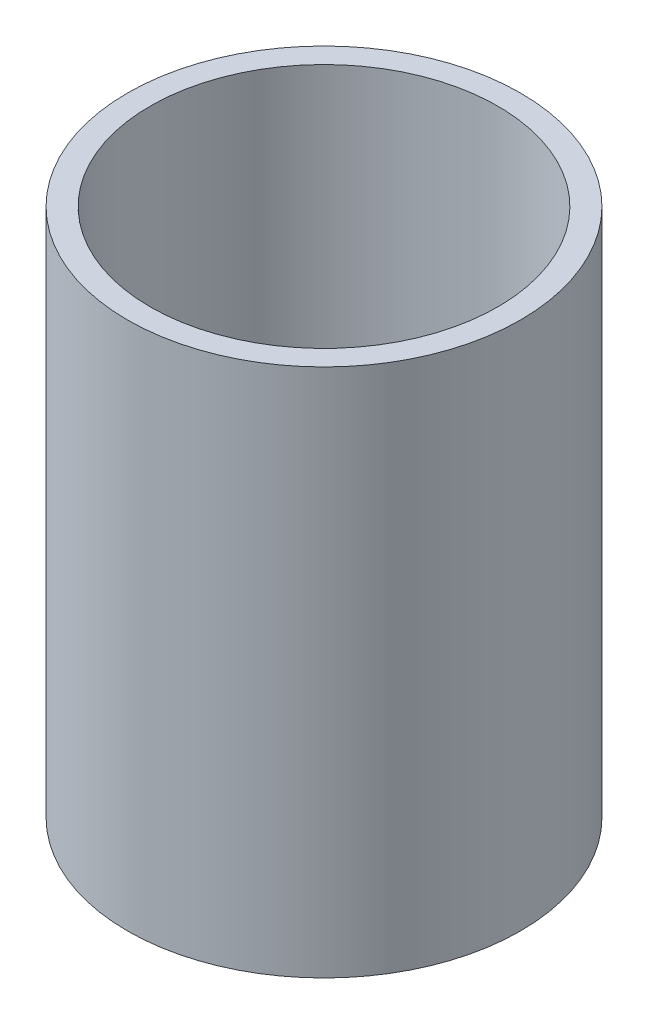
ISO-10303-21;
HEADER;
FILE_DESCRIPTION(('STEP AP214'),'2;1');
FILE_NAME('part.step','',(''),(''),'','','');
FILE_SCHEMA(('AUTOMOTIVE_DESIGN { 1 0 10303 214 1 1 1 1 }'));
ENDSEC;
DATA;
#1=APPLICATION_CONTEXT('core data for automotive mechanical design processes');
#2=APPLICATION_PROTOCOL_DEFINITION('international standard','automotive_design',2000,#1);
#3=PRODUCT_CONTEXT('',#1,'mechanical');
#4=PRODUCT('Part','Part','',(#3));
#5=PRODUCT_RELATED_PRODUCT_CATEGORY('part','',(#4));
#6=PRODUCT_DEFINITION_FORMATION('','',#4);
#7=PRODUCT_DEFINITION_CONTEXT('part definition',#1,'design');
#8=PRODUCT_DEFINITION('design','',#6,#7);
#9=PRODUCT_DEFINITION_SHAPE('','',#8);
#10=(LENGTH_UNIT() NAMED_UNIT(*) SI_UNIT(.MILLI.,.METRE.));
#11=(NAMED_UNIT(*) PLANE_ANGLE_UNIT() SI_UNIT($,.RADIAN.));
#12=(NAMED_UNIT(*) SI_UNIT($,.STERADIAN.) SOLID_ANGLE_UNIT());
#13=UNCERTAINTY_MEASURE_WITH_UNIT(LENGTH_MEASURE(1.E-05),#10,'distance_accuracy_value','');
#14=(GEOMETRIC_REPRESENTATION_CONTEXT(3) GLOBAL_UNCERTAINTY_ASSIGNED_CONTEXT((#13)) GLOBAL_UNIT_ASSIGNED_CONTEXT((#10,
#11,#12)) REPRESENTATION_CONTEXT('',''));
#15=CARTESIAN_POINT('',(0.,0.,0.));
#16=DIRECTION('',(0.,0.,1.));
#17=DIRECTION('',(1.,0.,0.));
#18=AXIS2_PLACEMENT_3D('',#15,#16,#17);
#19=CARTESIAN_POINT('',(0.,70.,0.));
#20=DIRECTION('',(0.,1.,0.));
#21=DIRECTION('',(0.,0.,1.));
#22=AXIS2_PLACEMENT_3D('',#19,#20,#21);
#23=PLANE('',#22);
#24=CARTESIAN_POINT('',(0.,70.,0.));
#25=DIRECTION('',(0.,1.,0.));
#26=DIRECTION('',(0.,0.,1.));
#27=AXIS2_PLACEMENT_3D('',#24,#25,#26);
#28=CIRCLE('',#27,26.);
#29=CARTESIAN_POINT('',(0.,70.,26.));
#30=VERTEX_POINT('',#29);
#31=EDGE_CURVE('E10',#30,#30,#28,.T.);
#32=ORIENTED_EDGE('',*,*,#31,.T.);
#33=EDGE_LOOP('',(#32));
#34=FACE_BOUND('',#33,.T.);
#35=CARTESIAN_POINT('',(0.,70.,0.));
#36=DIRECTION('',(0.,1.,0.));
#37=DIRECTION('',(0.,0.,1.));
#38=AXIS2_PLACEMENT_3D('',#35,#36,#37);
#39=CIRCLE('',#38,23.);
#40=CARTESIAN_POINT('',(0.,70.,23.));
#41=VERTEX_POINT('',#40);
#42=EDGE_CURVE('E46',#41,#41,#39,.T.);
#43=ORIENTED_EDGE('',*,*,#42,.F.);
#44=EDGE_LOOP('',(#43));
#45=FACE_BOUND('',#44,.T.);
#46=ADVANCED_FACE('F35',(#34,#45),#23,.T.);
#47=CARTESIAN_POINT('',(0.,0.,0.));
#48=DIRECTION('',(0.,1.,0.));
#49=DIRECTION('',(0.,0.,1.));
#50=AXIS2_PLACEMENT_3D('',#47,#48,#49);
#51=PLANE('',#50);
#52=CARTESIAN_POINT('',(0.,0.,0.));
#53=DIRECTION('',(0.,1.,0.));
#54=DIRECTION('',(0.,0.,1.));
#55=AXIS2_PLACEMENT_3D('',#52,#53,#54);
#56=CIRCLE('',#55,26.);
#57=CARTESIAN_POINT('',(0.,0.,26.));
#58=VERTEX_POINT('',#57);
#59=EDGE_CURVE('E39',#58,#58,#56,.T.);
#60=ORIENTED_EDGE('',*,*,#59,.F.);
#61=EDGE_LOOP('',(#60));
#62=FACE_BOUND('',#61,.T.);
#63=CARTESIAN_POINT('',(0.,0.,0.));
#64=DIRECTION('',(0.,1.,0.));
#65=DIRECTION('',(0.,0.,1.));
#66=AXIS2_PLACEMENT_3D('',#63,#64,#65);
#67=CIRCLE('',#66,23.);
#68=CARTESIAN_POINT('',(0.,0.,23.));
#69=VERTEX_POINT('',#68);
#70=EDGE_CURVE('E48',#69,#69,#67,.T.);
#71=ORIENTED_EDGE('',*,*,#70,.T.);
#72=EDGE_LOOP('',(#71));
#73=FACE_BOUND('',#72,.T.);
#74=ADVANCED_FACE('F58',(#62,#73),#51,.F.);
#75=CARTESIAN_POINT('',(0.,70.,0.));
#76=DIRECTION('',(0.,-1.,0.));
#77=DIRECTION('',(0.,0.,-1.));
#78=AXIS2_PLACEMENT_3D('',#75,#76,#77);
#79=CYLINDRICAL_SURFACE('',#78,26.);
#80=ORIENTED_EDGE('',*,*,#31,.F.);
#81=EDGE_LOOP('',(#80));
#82=FACE_BOUND('',#81,.T.);
#83=ORIENTED_EDGE('',*,*,#59,.T.);
#84=EDGE_LOOP('',(#83));
#85=FACE_BOUND('',#84,.T.);
#86=ADVANCED_FACE('F37',(#82,#85),#79,.T.);
#87=CARTESIAN_POINT('',(0.,70.,0.));
#88=DIRECTION('',(0.,-1.,0.));
#89=DIRECTION('',(0.,0.,-1.));
#90=AXIS2_PLACEMENT_3D('',#87,#88,#89);
#91=CYLINDRICAL_SURFACE('',#90,23.);
#92=ORIENTED_EDGE('',*,*,#42,.T.);
#93=EDGE_LOOP('',(#92));
#94=FACE_BOUND('',#93,.T.);
#95=ORIENTED_EDGE('',*,*,#70,.F.);
#96=EDGE_LOOP('',(#95));
#97=FACE_BOUND('',#96,.T.);
#98=ADVANCED_FACE('F54',(#94,#97),#91,.F.);
#99=CLOSED_SHELL('',(#46,#74,#86,#98));
#100=MANIFOLD_SOLID_BREP('B2',#99);
#101=ADVANCED_BREP_SHAPE_REPRESENTATION('',(#18,#100),#14);
#102=SHAPE_DEFINITION_REPRESENTATION(#9,#101);
ENDSEC;
END-ISO-10303-21;
